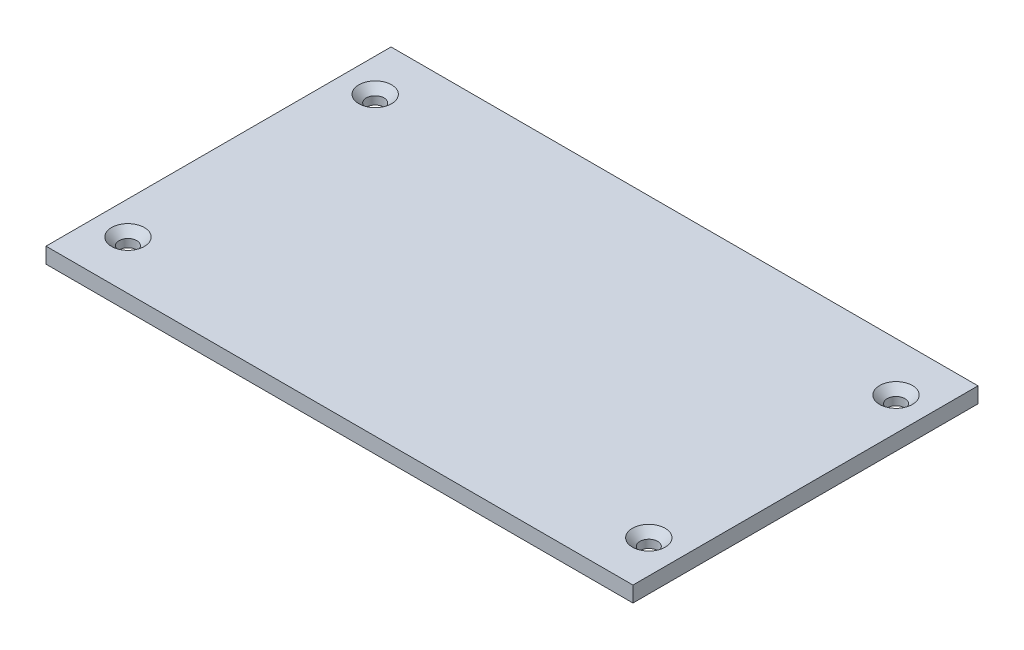
ISO-10303-21;
HEADER;
FILE_DESCRIPTION(('STEP AP214'),'2;1');
FILE_NAME('part.step','',(''),(''),'','','');
FILE_SCHEMA(('AUTOMOTIVE_DESIGN { 1 0 10303 214 1 1 1 1 }'));
ENDSEC;
DATA;
#1=APPLICATION_CONTEXT('core data for automotive mechanical design processes');
#2=APPLICATION_PROTOCOL_DEFINITION('international standard','automotive_design',2000,#1);
#3=PRODUCT_CONTEXT('',#1,'mechanical');
#4=PRODUCT('Part','Part','',(#3));
#5=PRODUCT_RELATED_PRODUCT_CATEGORY('part','',(#4));
#6=PRODUCT_DEFINITION_FORMATION('','',#4);
#7=PRODUCT_DEFINITION_CONTEXT('part definition',#1,'design');
#8=PRODUCT_DEFINITION('design','',#6,#7);
#9=PRODUCT_DEFINITION_SHAPE('','',#8);
#10=(LENGTH_UNIT() NAMED_UNIT(*) SI_UNIT(.MILLI.,.METRE.));
#11=(NAMED_UNIT(*) PLANE_ANGLE_UNIT() SI_UNIT($,.RADIAN.));
#12=(NAMED_UNIT(*) SI_UNIT($,.STERADIAN.) SOLID_ANGLE_UNIT());
#13=UNCERTAINTY_MEASURE_WITH_UNIT(LENGTH_MEASURE(1.E-05),#10,'distance_accuracy_value','');
#14=(GEOMETRIC_REPRESENTATION_CONTEXT(3) GLOBAL_UNCERTAINTY_ASSIGNED_CONTEXT((#13)) GLOBAL_UNIT_ASSIGNED_CONTEXT((#10,
#11,#12)) REPRESENTATION_CONTEXT('',''));
#15=CARTESIAN_POINT('',(0.,0.,0.));
#16=DIRECTION('',(0.,0.,1.));
#17=DIRECTION('',(1.,0.,0.));
#18=AXIS2_PLACEMENT_3D('',#15,#16,#17);
#19=CARTESIAN_POINT('',(-56.388,3.,33.147));
#20=DIRECTION('',(0.,0.,-1.));
#21=DIRECTION('',(-1.,0.,0.));
#22=AXIS2_PLACEMENT_3D('',#19,#20,#21);
#23=PLANE('',#22);
#24=DIRECTION('',(1.,0.,0.));
#25=VECTOR('',#24,1.);
#26=CARTESIAN_POINT('',(-56.388,0.,33.147));
#27=LINE('',#26,#25);
#28=CARTESIAN_POINT('',(-56.388,0.,33.147));
#29=VERTEX_POINT('',#28);
#30=CARTESIAN_POINT('',(56.388,0.,33.147));
#31=VERTEX_POINT('',#30);
#32=EDGE_CURVE('E99',#29,#31,#27,.T.);
#33=ORIENTED_EDGE('',*,*,#32,.T.);
#34=DIRECTION('',(0.,-1.,0.));
#35=VECTOR('',#34,1.);
#36=CARTESIAN_POINT('',(56.388,3.,33.147));
#37=LINE('',#36,#35);
#38=CARTESIAN_POINT('',(56.388,3.,33.147));
#39=VERTEX_POINT('',#38);
#40=EDGE_CURVE('E11',#39,#31,#37,.T.);
#41=ORIENTED_EDGE('',*,*,#40,.F.);
#42=DIRECTION('',(1.,0.,0.));
#43=VECTOR('',#42,1.);
#44=CARTESIAN_POINT('',(-56.388,3.,33.147));
#45=LINE('',#44,#43);
#46=CARTESIAN_POINT('',(-56.388,3.,33.147));
#47=VERTEX_POINT('',#46);
#48=EDGE_CURVE('E85',#47,#39,#45,.T.);
#49=ORIENTED_EDGE('',*,*,#48,.F.);
#50=DIRECTION('',(0.,-1.,0.));
#51=VECTOR('',#50,1.);
#52=CARTESIAN_POINT('',(-56.388,3.,33.147));
#53=LINE('',#52,#51);
#54=EDGE_CURVE('E52',#47,#29,#53,.T.);
#55=ORIENTED_EDGE('',*,*,#54,.T.);
#56=EDGE_LOOP('',(#33,#41,#49,#55));
#57=FACE_BOUND('',#56,.T.);
#58=ADVANCED_FACE('F36',(#57),#23,.F.);
#59=CARTESIAN_POINT('',(56.388,3.,33.147));
#60=DIRECTION('',(-1.,0.,0.));
#61=DIRECTION('',(0.,0.,1.));
#62=AXIS2_PLACEMENT_3D('',#59,#60,#61);
#63=PLANE('',#62);
#64=DIRECTION('',(0.,0.,-1.));
#65=VECTOR('',#64,1.);
#66=CARTESIAN_POINT('',(56.388,0.,33.147));
#67=LINE('',#66,#65);
#68=CARTESIAN_POINT('',(56.388,0.,-33.147));
#69=VERTEX_POINT('',#68);
#70=EDGE_CURVE('E90',#31,#69,#67,.T.);
#71=ORIENTED_EDGE('',*,*,#70,.T.);
#72=DIRECTION('',(0.,-1.,0.));
#73=VECTOR('',#72,1.);
#74=CARTESIAN_POINT('',(56.388,3.,-33.147));
#75=LINE('',#74,#73);
#76=CARTESIAN_POINT('',(56.388,3.,-33.147));
#77=VERTEX_POINT('',#76);
#78=EDGE_CURVE('E44',#77,#69,#75,.T.);
#79=ORIENTED_EDGE('',*,*,#78,.F.);
#80=DIRECTION('',(0.,0.,-1.));
#81=VECTOR('',#80,1.);
#82=CARTESIAN_POINT('',(56.388,3.,33.147));
#83=LINE('',#82,#81);
#84=EDGE_CURVE('E77',#39,#77,#83,.T.);
#85=ORIENTED_EDGE('',*,*,#84,.F.);
#86=ORIENTED_EDGE('',*,*,#40,.T.);
#87=EDGE_LOOP('',(#71,#79,#85,#86));
#88=FACE_BOUND('',#87,.T.);
#89=ADVANCED_FACE('F89',(#88),#63,.F.);
#90=CARTESIAN_POINT('',(-56.388,3.,-33.147));
#91=DIRECTION('',(0.,0.,-1.));
#92=DIRECTION('',(-1.,0.,0.));
#93=AXIS2_PLACEMENT_3D('',#90,#91,#92);
#94=PLANE('',#93);
#95=DIRECTION('',(1.,0.,0.));
#96=VECTOR('',#95,1.);
#97=CARTESIAN_POINT('',(-56.388,0.,-33.147));
#98=LINE('',#97,#96);
#99=CARTESIAN_POINT('',(-56.388,0.,-33.147));
#100=VERTEX_POINT('',#99);
#101=EDGE_CURVE('E103',#100,#69,#98,.T.);
#102=ORIENTED_EDGE('',*,*,#101,.F.);
#103=DIRECTION('',(0.,-1.,0.));
#104=VECTOR('',#103,1.);
#105=CARTESIAN_POINT('',(-56.388,3.,-33.147));
#106=LINE('',#105,#104);
#107=CARTESIAN_POINT('',(-56.388,3.,-33.147));
#108=VERTEX_POINT('',#107);
#109=EDGE_CURVE('E66',#108,#100,#106,.T.);
#110=ORIENTED_EDGE('',*,*,#109,.F.);
#111=DIRECTION('',(1.,0.,0.));
#112=VECTOR('',#111,1.);
#113=CARTESIAN_POINT('',(-56.388,3.,-33.147));
#114=LINE('',#113,#112);
#115=EDGE_CURVE('E84',#108,#77,#114,.T.);
#116=ORIENTED_EDGE('',*,*,#115,.T.);
#117=ORIENTED_EDGE('',*,*,#78,.T.);
#118=EDGE_LOOP('',(#102,#110,#116,#117));
#119=FACE_BOUND('',#118,.T.);
#120=ADVANCED_FACE('F93',(#119),#94,.T.);
#121=CARTESIAN_POINT('',(-56.388,3.,33.147));
#122=DIRECTION('',(-1.,0.,0.));
#123=DIRECTION('',(0.,0.,1.));
#124=AXIS2_PLACEMENT_3D('',#121,#122,#123);
#125=PLANE('',#124);
#126=DIRECTION('',(0.,0.,-1.));
#127=VECTOR('',#126,1.);
#128=CARTESIAN_POINT('',(-56.388,0.,33.147));
#129=LINE('',#128,#127);
#130=EDGE_CURVE('E105',#29,#100,#129,.T.);
#131=ORIENTED_EDGE('',*,*,#130,.F.);
#132=ORIENTED_EDGE('',*,*,#54,.F.);
#133=DIRECTION('',(0.,0.,-1.));
#134=VECTOR('',#133,1.);
#135=CARTESIAN_POINT('',(-56.388,3.,33.147));
#136=LINE('',#135,#134);
#137=EDGE_CURVE('E94',#47,#108,#136,.T.);
#138=ORIENTED_EDGE('',*,*,#137,.T.);
#139=ORIENTED_EDGE('',*,*,#109,.T.);
#140=EDGE_LOOP('',(#131,#132,#138,#139));
#141=FACE_BOUND('',#140,.T.);
#142=ADVANCED_FACE('F152',(#141),#125,.T.);
#143=CARTESIAN_POINT('',(0.,3.,0.));
#144=DIRECTION('',(0.,1.,0.));
#145=DIRECTION('',(0.,0.,1.));
#146=AXIS2_PLACEMENT_3D('',#143,#144,#145);
#147=PLANE('',#146);
#148=CARTESIAN_POINT('',(-50.038,3.,-23.749));
#149=DIRECTION('',(0.,1.,0.));
#150=DIRECTION('',(0.,0.,1.));
#151=AXIS2_PLACEMENT_3D('',#148,#149,#150);
#152=CIRCLE('',#151,3.15);
#153=CARTESIAN_POINT('',(-50.038,3.,-20.599));
#154=VERTEX_POINT('',#153);
#155=EDGE_CURVE('E143',#154,#154,#152,.T.);
#156=ORIENTED_EDGE('',*,*,#155,.F.);
#157=EDGE_LOOP('',(#156));
#158=FACE_BOUND('',#157,.T.);
#159=CARTESIAN_POINT('',(-50.038,3.,23.749));
#160=DIRECTION('',(0.,1.,0.));
#161=DIRECTION('',(0.,0.,1.));
#162=AXIS2_PLACEMENT_3D('',#159,#160,#161);
#163=CIRCLE('',#162,3.15);
#164=CARTESIAN_POINT('',(-50.038,3.,26.899));
#165=VERTEX_POINT('',#164);
#166=EDGE_CURVE('E134',#165,#165,#163,.T.);
#167=ORIENTED_EDGE('',*,*,#166,.F.);
#168=EDGE_LOOP('',(#167));
#169=FACE_BOUND('',#168,.T.);
#170=CARTESIAN_POINT('',(50.038,3.,23.749));
#171=DIRECTION('',(0.,1.,0.));
#172=DIRECTION('',(0.,0.,1.));
#173=AXIS2_PLACEMENT_3D('',#170,#171,#172);
#174=CIRCLE('',#173,3.15);
#175=CARTESIAN_POINT('',(50.038,3.,26.899));
#176=VERTEX_POINT('',#175);
#177=EDGE_CURVE('E125',#176,#176,#174,.T.);
#178=ORIENTED_EDGE('',*,*,#177,.F.);
#179=EDGE_LOOP('',(#178));
#180=FACE_BOUND('',#179,.T.);
#181=CARTESIAN_POINT('',(50.038,3.,-23.749));
#182=DIRECTION('',(0.,1.,0.));
#183=DIRECTION('',(0.,0.,1.));
#184=AXIS2_PLACEMENT_3D('',#181,#182,#183);
#185=CIRCLE('',#184,3.15);
#186=CARTESIAN_POINT('',(50.038,3.,-20.599));
#187=VERTEX_POINT('',#186);
#188=EDGE_CURVE('E116',#187,#187,#185,.T.);
#189=ORIENTED_EDGE('',*,*,#188,.F.);
#190=EDGE_LOOP('',(#189));
#191=FACE_BOUND('',#190,.T.);
#192=ORIENTED_EDGE('',*,*,#48,.T.);
#193=ORIENTED_EDGE('',*,*,#84,.T.);
#194=ORIENTED_EDGE('',*,*,#115,.F.);
#195=ORIENTED_EDGE('',*,*,#137,.F.);
#196=EDGE_LOOP('',(#192,#193,#194,#195));
#197=FACE_BOUND('',#196,.T.);
#198=ADVANCED_FACE('F81',(#158,#169,#180,#191,#197),#147,.T.);
#199=CARTESIAN_POINT('',(0.,0.,0.));
#200=DIRECTION('',(0.,1.,0.));
#201=DIRECTION('',(0.,0.,1.));
#202=AXIS2_PLACEMENT_3D('',#199,#200,#201);
#203=PLANE('',#202);
#204=CARTESIAN_POINT('',(-50.038,0.,-23.749));
#205=DIRECTION('',(0.,1.,0.));
#206=DIRECTION('',(0.,0.,1.));
#207=AXIS2_PLACEMENT_3D('',#204,#205,#206);
#208=CIRCLE('',#207,1.69999999999999);
#209=CARTESIAN_POINT('',(-50.038,0.,-22.049));
#210=VERTEX_POINT('',#209);
#211=EDGE_CURVE('E137',#210,#210,#208,.T.);
#212=ORIENTED_EDGE('',*,*,#211,.T.);
#213=EDGE_LOOP('',(#212));
#214=FACE_BOUND('',#213,.T.);
#215=CARTESIAN_POINT('',(-50.038,0.,23.749));
#216=DIRECTION('',(0.,1.,0.));
#217=DIRECTION('',(0.,0.,1.));
#218=AXIS2_PLACEMENT_3D('',#215,#216,#217);
#219=CIRCLE('',#218,1.69999999999999);
#220=CARTESIAN_POINT('',(-50.038,0.,25.449));
#221=VERTEX_POINT('',#220);
#222=EDGE_CURVE('E128',#221,#221,#219,.T.);
#223=ORIENTED_EDGE('',*,*,#222,.T.);
#224=EDGE_LOOP('',(#223));
#225=FACE_BOUND('',#224,.T.);
#226=CARTESIAN_POINT('',(50.038,0.,23.749));
#227=DIRECTION('',(0.,1.,0.));
#228=DIRECTION('',(0.,0.,1.));
#229=AXIS2_PLACEMENT_3D('',#226,#227,#228);
#230=CIRCLE('',#229,1.69999999999999);
#231=CARTESIAN_POINT('',(50.038,0.,25.449));
#232=VERTEX_POINT('',#231);
#233=EDGE_CURVE('E119',#232,#232,#230,.T.);
#234=ORIENTED_EDGE('',*,*,#233,.T.);
#235=EDGE_LOOP('',(#234));
#236=FACE_BOUND('',#235,.T.);
#237=CARTESIAN_POINT('',(50.038,0.,-23.749));
#238=DIRECTION('',(0.,1.,0.));
#239=DIRECTION('',(0.,0.,1.));
#240=AXIS2_PLACEMENT_3D('',#237,#238,#239);
#241=CIRCLE('',#240,1.69999999999999);
#242=CARTESIAN_POINT('',(50.038,0.,-22.049));
#243=VERTEX_POINT('',#242);
#244=EDGE_CURVE('E101',#243,#243,#241,.T.);
#245=ORIENTED_EDGE('',*,*,#244,.T.);
#246=EDGE_LOOP('',(#245));
#247=FACE_BOUND('',#246,.T.);
#248=ORIENTED_EDGE('',*,*,#32,.F.);
#249=ORIENTED_EDGE('',*,*,#130,.T.);
#250=ORIENTED_EDGE('',*,*,#101,.T.);
#251=ORIENTED_EDGE('',*,*,#70,.F.);
#252=EDGE_LOOP('',(#248,#249,#250,#251));
#253=FACE_BOUND('',#252,.T.);
#254=ADVANCED_FACE('F151',(#214,#225,#236,#247,#253),#203,.F.);
#255=CARTESIAN_POINT('',(50.038,3.,-23.749));
#256=DIRECTION('',(0.,1.,0.));
#257=DIRECTION('',(0.,0.,1.));
#258=AXIS2_PLACEMENT_3D('',#255,#256,#257);
#259=CYLINDRICAL_SURFACE('',#258,1.69999999999999);
#260=ORIENTED_EDGE('',*,*,#244,.F.);
#261=EDGE_LOOP('',(#260));
#262=FACE_BOUND('',#261,.T.);
#263=CARTESIAN_POINT('',(50.038,1.54999999999999,-23.749));
#264=DIRECTION('',(0.,1.,0.));
#265=DIRECTION('',(0.,0.,1.));
#266=AXIS2_PLACEMENT_3D('',#263,#264,#265);
#267=CIRCLE('',#266,1.69999999999999);
#268=CARTESIAN_POINT('',(50.038,1.54999999999999,-22.049));
#269=VERTEX_POINT('',#268);
#270=EDGE_CURVE('E113',#269,#269,#267,.T.);
#271=ORIENTED_EDGE('',*,*,#270,.T.);
#272=EDGE_LOOP('',(#271));
#273=FACE_BOUND('',#272,.T.);
#274=ADVANCED_FACE('F163',(#262,#273),#259,.F.);
#275=CARTESIAN_POINT('',(50.038,3.,-23.749));
#276=DIRECTION('',(0.,1.,0.));
#277=DIRECTION('',(0.,0.,1.));
#278=AXIS2_PLACEMENT_3D('',#275,#276,#277);
#279=CONICAL_SURFACE('',#278,3.15,0.78539816339745);
#280=ORIENTED_EDGE('',*,*,#270,.F.);
#281=EDGE_LOOP('',(#280));
#282=FACE_BOUND('',#281,.T.);
#283=ORIENTED_EDGE('',*,*,#188,.T.);
#284=EDGE_LOOP('',(#283));
#285=FACE_BOUND('',#284,.T.);
#286=ADVANCED_FACE('F160',(#282,#285),#279,.F.);
#287=CARTESIAN_POINT('',(50.038,3.,23.749));
#288=DIRECTION('',(0.,1.,0.));
#289=DIRECTION('',(0.,0.,1.));
#290=AXIS2_PLACEMENT_3D('',#287,#288,#289);
#291=CYLINDRICAL_SURFACE('',#290,1.69999999999999);
#292=ORIENTED_EDGE('',*,*,#233,.F.);
#293=EDGE_LOOP('',(#292));
#294=FACE_BOUND('',#293,.T.);
#295=CARTESIAN_POINT('',(50.038,1.54999999999999,23.749));
#296=DIRECTION('',(0.,1.,0.));
#297=DIRECTION('',(0.,0.,1.));
#298=AXIS2_PLACEMENT_3D('',#295,#296,#297);
#299=CIRCLE('',#298,1.69999999999999);
#300=CARTESIAN_POINT('',(50.038,1.54999999999999,25.449));
#301=VERTEX_POINT('',#300);
#302=EDGE_CURVE('E122',#301,#301,#299,.T.);
#303=ORIENTED_EDGE('',*,*,#302,.T.);
#304=EDGE_LOOP('',(#303));
#305=FACE_BOUND('',#304,.T.);
#306=ADVANCED_FACE('F162',(#294,#305),#291,.F.);
#307=CARTESIAN_POINT('',(50.038,3.,23.749));
#308=DIRECTION('',(0.,1.,0.));
#309=DIRECTION('',(0.,0.,1.));
#310=AXIS2_PLACEMENT_3D('',#307,#308,#309);
#311=CONICAL_SURFACE('',#310,3.15,0.78539816339745);
#312=ORIENTED_EDGE('',*,*,#302,.F.);
#313=EDGE_LOOP('',(#312));
#314=FACE_BOUND('',#313,.T.);
#315=ORIENTED_EDGE('',*,*,#177,.T.);
#316=EDGE_LOOP('',(#315));
#317=FACE_BOUND('',#316,.T.);
#318=ADVANCED_FACE('F170',(#314,#317),#311,.F.);
#319=CARTESIAN_POINT('',(-50.038,3.,23.749));
#320=DIRECTION('',(0.,1.,0.));
#321=DIRECTION('',(0.,0.,1.));
#322=AXIS2_PLACEMENT_3D('',#319,#320,#321);
#323=CYLINDRICAL_SURFACE('',#322,1.69999999999999);
#324=ORIENTED_EDGE('',*,*,#222,.F.);
#325=EDGE_LOOP('',(#324));
#326=FACE_BOUND('',#325,.T.);
#327=CARTESIAN_POINT('',(-50.038,1.54999999999999,23.749));
#328=DIRECTION('',(0.,1.,0.));
#329=DIRECTION('',(0.,0.,1.));
#330=AXIS2_PLACEMENT_3D('',#327,#328,#329);
#331=CIRCLE('',#330,1.69999999999999);
#332=CARTESIAN_POINT('',(-50.038,1.54999999999999,25.449));
#333=VERTEX_POINT('',#332);
#334=EDGE_CURVE('E131',#333,#333,#331,.T.);
#335=ORIENTED_EDGE('',*,*,#334,.T.);
#336=EDGE_LOOP('',(#335));
#337=FACE_BOUND('',#336,.T.);
#338=ADVANCED_FACE('F204',(#326,#337),#323,.F.);
#339=CARTESIAN_POINT('',(-50.038,3.,23.749));
#340=DIRECTION('',(0.,1.,0.));
#341=DIRECTION('',(0.,0.,1.));
#342=AXIS2_PLACEMENT_3D('',#339,#340,#341);
#343=CONICAL_SURFACE('',#342,3.15,0.78539816339745);
#344=ORIENTED_EDGE('',*,*,#334,.F.);
#345=EDGE_LOOP('',(#344));
#346=FACE_BOUND('',#345,.T.);
#347=ORIENTED_EDGE('',*,*,#166,.T.);
#348=EDGE_LOOP('',(#347));
#349=FACE_BOUND('',#348,.T.);
#350=ADVANCED_FACE('F209',(#346,#349),#343,.F.);
#351=CARTESIAN_POINT('',(-50.038,3.,-23.749));
#352=DIRECTION('',(0.,1.,0.));
#353=DIRECTION('',(0.,0.,1.));
#354=AXIS2_PLACEMENT_3D('',#351,#352,#353);
#355=CYLINDRICAL_SURFACE('',#354,1.69999999999999);
#356=ORIENTED_EDGE('',*,*,#211,.F.);
#357=EDGE_LOOP('',(#356));
#358=FACE_BOUND('',#357,.T.);
#359=CARTESIAN_POINT('',(-50.038,1.54999999999999,-23.749));
#360=DIRECTION('',(0.,1.,0.));
#361=DIRECTION('',(0.,0.,1.));
#362=AXIS2_PLACEMENT_3D('',#359,#360,#361);
#363=CIRCLE('',#362,1.69999999999999);
#364=CARTESIAN_POINT('',(-50.038,1.54999999999999,-22.049));
#365=VERTEX_POINT('',#364);
#366=EDGE_CURVE('E140',#365,#365,#363,.T.);
#367=ORIENTED_EDGE('',*,*,#366,.T.);
#368=EDGE_LOOP('',(#367));
#369=FACE_BOUND('',#368,.T.);
#370=ADVANCED_FACE('F215',(#358,#369),#355,.F.);
#371=CARTESIAN_POINT('',(-50.038,3.,-23.749));
#372=DIRECTION('',(0.,1.,0.));
#373=DIRECTION('',(0.,0.,1.));
#374=AXIS2_PLACEMENT_3D('',#371,#372,#373);
#375=CONICAL_SURFACE('',#374,3.15,0.78539816339745);
#376=ORIENTED_EDGE('',*,*,#366,.F.);
#377=EDGE_LOOP('',(#376));
#378=FACE_BOUND('',#377,.T.);
#379=ORIENTED_EDGE('',*,*,#155,.T.);
#380=EDGE_LOOP('',(#379));
#381=FACE_BOUND('',#380,.T.);
#382=ADVANCED_FACE('F147',(#378,#381),#375,.F.);
#383=CLOSED_SHELL('',(#58,#89,#120,#142,#198,#254,#274,#286,#306,#318,#338,#350,#370,#382));
#384=MANIFOLD_SOLID_BREP('B2',#383);
#385=ADVANCED_BREP_SHAPE_REPRESENTATION('',(#18,#384),#14);
#386=SHAPE_DEFINITION_REPRESENTATION(#9,#385);
ENDSEC;
END-ISO-10303-21;
